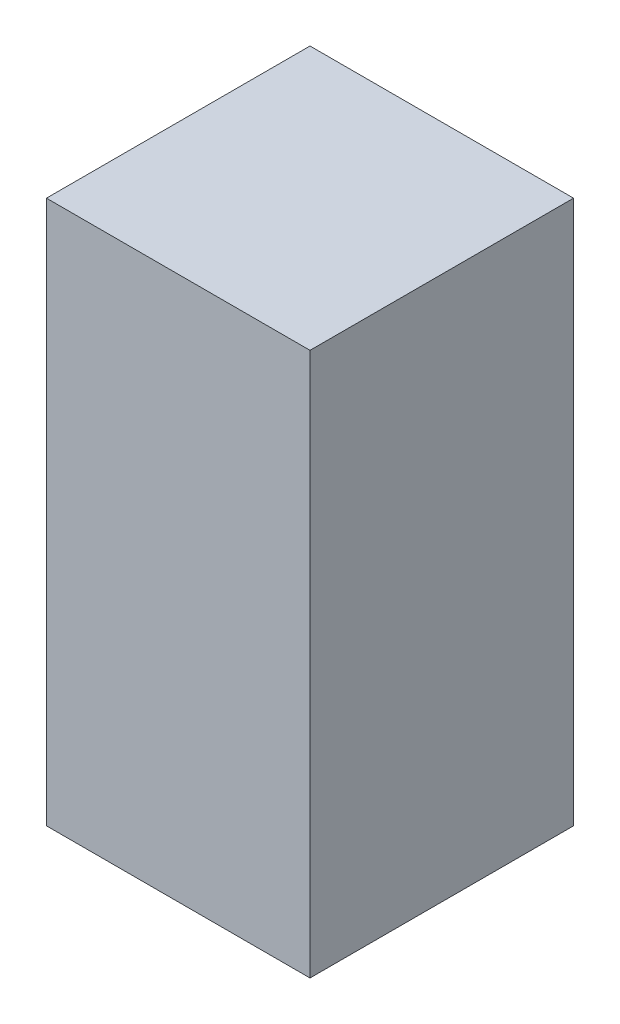
ISO-10303-21;
HEADER;
FILE_DESCRIPTION(('STEP AP214'),'2;1');
FILE_NAME('part.step','',(''),(''),'','','');
FILE_SCHEMA(('AUTOMOTIVE_DESIGN { 1 0 10303 214 1 1 1 1 }'));
ENDSEC;
DATA;
#1=APPLICATION_CONTEXT('core data for automotive mechanical design processes');
#2=APPLICATION_PROTOCOL_DEFINITION('international standard','automotive_design',2000,#1);
#3=PRODUCT_CONTEXT('',#1,'mechanical');
#4=PRODUCT('Part','Part','',(#3));
#5=PRODUCT_RELATED_PRODUCT_CATEGORY('part','',(#4));
#6=PRODUCT_DEFINITION_FORMATION('','',#4);
#7=PRODUCT_DEFINITION_CONTEXT('part definition',#1,'design');
#8=PRODUCT_DEFINITION('design','',#6,#7);
#9=PRODUCT_DEFINITION_SHAPE('','',#8);
#10=(LENGTH_UNIT() NAMED_UNIT(*) SI_UNIT(.MILLI.,.METRE.));
#11=(NAMED_UNIT(*) PLANE_ANGLE_UNIT() SI_UNIT($,.RADIAN.));
#12=(NAMED_UNIT(*) SI_UNIT($,.STERADIAN.) SOLID_ANGLE_UNIT());
#13=UNCERTAINTY_MEASURE_WITH_UNIT(LENGTH_MEASURE(1.E-05),#10,'distance_accuracy_value','');
#14=(GEOMETRIC_REPRESENTATION_CONTEXT(3) GLOBAL_UNCERTAINTY_ASSIGNED_CONTEXT((#13)) GLOBAL_UNIT_ASSIGNED_CONTEXT((#10,
#11,#12)) REPRESENTATION_CONTEXT('',''));
#15=CARTESIAN_POINT('',(0.,0.,0.));
#16=DIRECTION('',(0.,0.,1.));
#17=DIRECTION('',(1.,0.,0.));
#18=AXIS2_PLACEMENT_3D('',#15,#16,#17);
#19=CARTESIAN_POINT('',(0.,347.07576,0.));
#20=DIRECTION('',(1.,0.,0.));
#21=DIRECTION('',(0.,0.,-1.));
#22=AXIS2_PLACEMENT_3D('',#19,#20,#21);
#23=PLANE('',#22);
#24=DIRECTION('',(0.,0.,1.));
#25=VECTOR('',#24,1.);
#26=CARTESIAN_POINT('',(0.,0.,0.));
#27=LINE('',#26,#25);
#28=CARTESIAN_POINT('',(0.,0.,0.));
#29=VERTEX_POINT('',#28);
#30=CARTESIAN_POINT('',(0.,0.,168.275));
#31=VERTEX_POINT('',#30);
#32=EDGE_CURVE('E110',#29,#31,#27,.T.);
#33=ORIENTED_EDGE('',*,*,#32,.T.);
#34=DIRECTION('',(0.,-1.,0.));
#35=VECTOR('',#34,1.);
#36=CARTESIAN_POINT('',(0.,347.07576,168.275));
#37=LINE('',#36,#35);
#38=CARTESIAN_POINT('',(0.,347.07576,168.275));
#39=VERTEX_POINT('',#38);
#40=EDGE_CURVE('E11',#39,#31,#37,.T.);
#41=ORIENTED_EDGE('',*,*,#40,.F.);
#42=DIRECTION('',(0.,0.,1.));
#43=VECTOR('',#42,1.);
#44=CARTESIAN_POINT('',(0.,347.07576,0.));
#45=LINE('',#44,#43);
#46=CARTESIAN_POINT('',(0.,347.07576,0.));
#47=VERTEX_POINT('',#46);
#48=EDGE_CURVE('E94',#47,#39,#45,.T.);
#49=ORIENTED_EDGE('',*,*,#48,.F.);
#50=DIRECTION('',(0.,-1.,0.));
#51=VECTOR('',#50,1.);
#52=CARTESIAN_POINT('',(0.,347.07576,0.));
#53=LINE('',#52,#51);
#54=EDGE_CURVE('E106',#47,#29,#53,.T.);
#55=ORIENTED_EDGE('',*,*,#54,.T.);
#56=EDGE_LOOP('',(#33,#41,#49,#55));
#57=FACE_BOUND('',#56,.T.);
#58=ADVANCED_FACE('F42',(#57),#23,.F.);
#59=CARTESIAN_POINT('',(0.,347.07576,168.275));
#60=DIRECTION('',(0.,0.,-1.));
#61=DIRECTION('',(-1.,0.,0.));
#62=AXIS2_PLACEMENT_3D('',#59,#60,#61);
#63=PLANE('',#62);
#64=DIRECTION('',(1.,0.,0.));
#65=VECTOR('',#64,1.);
#66=CARTESIAN_POINT('',(0.,0.,168.275));
#67=LINE('',#66,#65);
#68=CARTESIAN_POINT('',(168.275,0.,168.275));
#69=VERTEX_POINT('',#68);
#70=EDGE_CURVE('E99',#31,#69,#67,.T.);
#71=ORIENTED_EDGE('',*,*,#70,.T.);
#72=DIRECTION('',(0.,-1.,0.));
#73=VECTOR('',#72,1.);
#74=CARTESIAN_POINT('',(168.275,347.07576,168.275));
#75=LINE('',#74,#73);
#76=CARTESIAN_POINT('',(168.275,347.07576,168.275));
#77=VERTEX_POINT('',#76);
#78=EDGE_CURVE('E51',#77,#69,#75,.T.);
#79=ORIENTED_EDGE('',*,*,#78,.F.);
#80=DIRECTION('',(1.,0.,0.));
#81=VECTOR('',#80,1.);
#82=CARTESIAN_POINT('',(0.,347.07576,168.275));
#83=LINE('',#82,#81);
#84=EDGE_CURVE('E89',#39,#77,#83,.T.);
#85=ORIENTED_EDGE('',*,*,#84,.F.);
#86=ORIENTED_EDGE('',*,*,#40,.T.);
#87=EDGE_LOOP('',(#71,#79,#85,#86));
#88=FACE_BOUND('',#87,.T.);
#89=ADVANCED_FACE('F98',(#88),#63,.F.);
#90=CARTESIAN_POINT('',(168.275,347.07576,0.));
#91=DIRECTION('',(-1.,0.,0.));
#92=DIRECTION('',(0.,0.,1.));
#93=AXIS2_PLACEMENT_3D('',#90,#91,#92);
#94=PLANE('',#93);
#95=DIRECTION('',(0.,0.,-1.));
#96=VECTOR('',#95,1.);
#97=CARTESIAN_POINT('',(168.275,0.,0.));
#98=LINE('',#97,#96);
#99=CARTESIAN_POINT('',(168.275,0.,0.));
#100=VERTEX_POINT('',#99);
#101=EDGE_CURVE('E76',#69,#100,#98,.T.);
#102=ORIENTED_EDGE('',*,*,#101,.T.);
#103=DIRECTION('',(0.,-1.,0.));
#104=VECTOR('',#103,1.);
#105=CARTESIAN_POINT('',(168.275,347.07576,0.));
#106=LINE('',#105,#104);
#107=CARTESIAN_POINT('',(168.275,347.07576,0.));
#108=VERTEX_POINT('',#107);
#109=EDGE_CURVE('E101',#108,#100,#106,.T.);
#110=ORIENTED_EDGE('',*,*,#109,.F.);
#111=DIRECTION('',(0.,0.,-1.));
#112=VECTOR('',#111,1.);
#113=CARTESIAN_POINT('',(168.275,347.07576,0.));
#114=LINE('',#113,#112);
#115=EDGE_CURVE('E92',#77,#108,#114,.T.);
#116=ORIENTED_EDGE('',*,*,#115,.F.);
#117=ORIENTED_EDGE('',*,*,#78,.T.);
#118=EDGE_LOOP('',(#102,#110,#116,#117));
#119=FACE_BOUND('',#118,.T.);
#120=ADVANCED_FACE('F102',(#119),#94,.F.);
#121=CARTESIAN_POINT('',(0.,347.07576,0.));
#122=DIRECTION('',(0.,0.,1.));
#123=DIRECTION('',(1.,0.,0.));
#124=AXIS2_PLACEMENT_3D('',#121,#122,#123);
#125=PLANE('',#124);
#126=DIRECTION('',(-1.,0.,0.));
#127=VECTOR('',#126,1.);
#128=CARTESIAN_POINT('',(0.,0.,0.));
#129=LINE('',#128,#127);
#130=EDGE_CURVE('E82',#100,#29,#129,.T.);
#131=ORIENTED_EDGE('',*,*,#130,.T.);
#132=ORIENTED_EDGE('',*,*,#54,.F.);
#133=DIRECTION('',(-1.,0.,0.));
#134=VECTOR('',#133,1.);
#135=CARTESIAN_POINT('',(0.,347.07576,0.));
#136=LINE('',#135,#134);
#137=EDGE_CURVE('E59',#108,#47,#136,.T.);
#138=ORIENTED_EDGE('',*,*,#137,.F.);
#139=ORIENTED_EDGE('',*,*,#109,.T.);
#140=EDGE_LOOP('',(#131,#132,#138,#139));
#141=FACE_BOUND('',#140,.T.);
#142=ADVANCED_FACE('F123',(#141),#125,.F.);
#143=CARTESIAN_POINT('',(0.,347.07576,0.));
#144=DIRECTION('',(0.,1.,0.));
#145=DIRECTION('',(0.,0.,1.));
#146=AXIS2_PLACEMENT_3D('',#143,#144,#145);
#147=PLANE('',#146);
#148=ORIENTED_EDGE('',*,*,#48,.T.);
#149=ORIENTED_EDGE('',*,*,#84,.T.);
#150=ORIENTED_EDGE('',*,*,#115,.T.);
#151=ORIENTED_EDGE('',*,*,#137,.T.);
#152=EDGE_LOOP('',(#148,#149,#150,#151));
#153=FACE_BOUND('',#152,.T.);
#154=ADVANCED_FACE('F90',(#153),#147,.T.);
#155=CARTESIAN_POINT('',(0.,0.,0.));
#156=DIRECTION('',(0.,1.,0.));
#157=DIRECTION('',(0.,0.,1.));
#158=AXIS2_PLACEMENT_3D('',#155,#156,#157);
#159=PLANE('',#158);
#160=ORIENTED_EDGE('',*,*,#32,.F.);
#161=ORIENTED_EDGE('',*,*,#130,.F.);
#162=ORIENTED_EDGE('',*,*,#101,.F.);
#163=ORIENTED_EDGE('',*,*,#70,.F.);
#164=EDGE_LOOP('',(#160,#161,#162,#163));
#165=FACE_BOUND('',#164,.T.);
#166=ADVANCED_FACE('F126',(#165),#159,.F.);
#167=CLOSED_SHELL('',(#58,#89,#120,#142,#154,#166));
#168=MANIFOLD_SOLID_BREP('B2',#167);
#169=ADVANCED_BREP_SHAPE_REPRESENTATION('',(#18,#168),#14);
#170=SHAPE_DEFINITION_REPRESENTATION(#9,#169);
ENDSEC;
END-ISO-10303-21;
